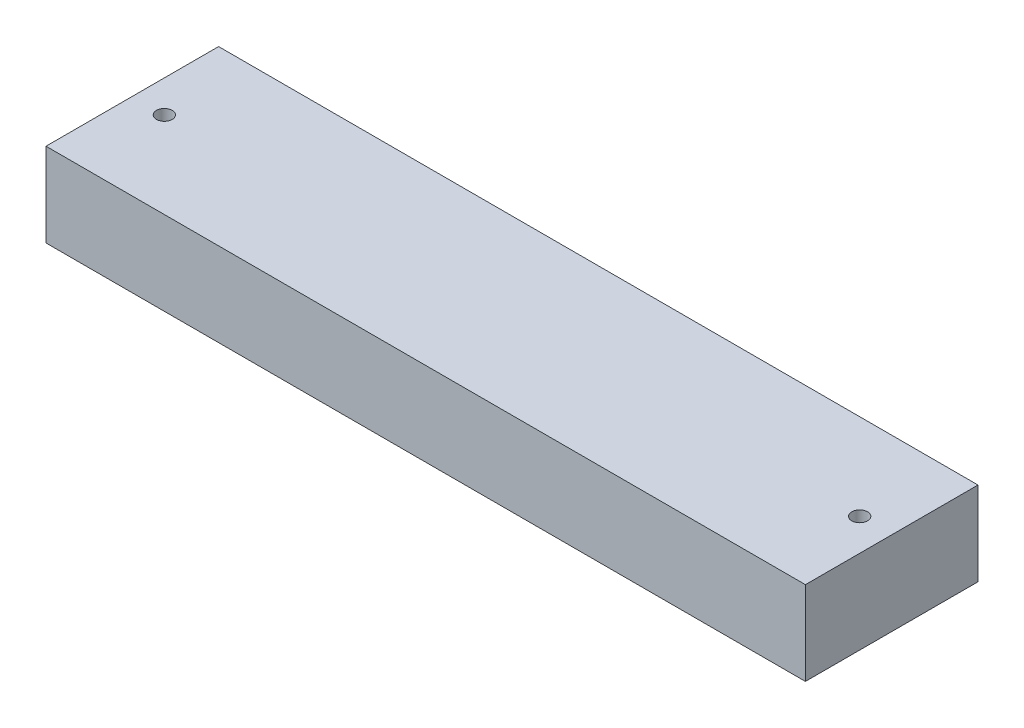
ISO-10303-21;
HEADER;
FILE_DESCRIPTION(('STEP AP214'),'2;1');
FILE_NAME('part.step','',(''),(''),'','','');
FILE_SCHEMA(('AUTOMOTIVE_DESIGN { 1 0 10303 214 1 1 1 1 }'));
ENDSEC;
DATA;
#1=APPLICATION_CONTEXT('core data for automotive mechanical design processes');
#2=APPLICATION_PROTOCOL_DEFINITION('international standard','automotive_design',2000,#1);
#3=PRODUCT_CONTEXT('',#1,'mechanical');
#4=PRODUCT('Part','Part','',(#3));
#5=PRODUCT_RELATED_PRODUCT_CATEGORY('part','',(#4));
#6=PRODUCT_DEFINITION_FORMATION('','',#4);
#7=PRODUCT_DEFINITION_CONTEXT('part definition',#1,'design');
#8=PRODUCT_DEFINITION('design','',#6,#7);
#9=PRODUCT_DEFINITION_SHAPE('','',#8);
#10=(LENGTH_UNIT() NAMED_UNIT(*) SI_UNIT(.MILLI.,.METRE.));
#11=(NAMED_UNIT(*) PLANE_ANGLE_UNIT() SI_UNIT($,.RADIAN.));
#12=(NAMED_UNIT(*) SI_UNIT($,.STERADIAN.) SOLID_ANGLE_UNIT());
#13=UNCERTAINTY_MEASURE_WITH_UNIT(LENGTH_MEASURE(1.E-05),#10,'distance_accuracy_value','');
#14=(GEOMETRIC_REPRESENTATION_CONTEXT(3) GLOBAL_UNCERTAINTY_ASSIGNED_CONTEXT((#13)) GLOBAL_UNIT_ASSIGNED_CONTEXT((#10,
#11,#12)) REPRESENTATION_CONTEXT('',''));
#15=CARTESIAN_POINT('',(0.,0.,0.));
#16=DIRECTION('',(0.,0.,1.));
#17=DIRECTION('',(1.,0.,0.));
#18=AXIS2_PLACEMENT_3D('',#15,#16,#17);
#19=CARTESIAN_POINT('',(77.,17.,17.5));
#20=DIRECTION('',(-1.,0.,0.));
#21=DIRECTION('',(0.,0.,1.));
#22=AXIS2_PLACEMENT_3D('',#19,#20,#21);
#23=PLANE('',#22);
#24=DIRECTION('',(0.,0.,-1.));
#25=VECTOR('',#24,1.);
#26=CARTESIAN_POINT('',(77.,0.,17.5));
#27=LINE('',#26,#25);
#28=CARTESIAN_POINT('',(77.,0.,17.5));
#29=VERTEX_POINT('',#28);
#30=CARTESIAN_POINT('',(77.,0.,-17.5));
#31=VERTEX_POINT('',#30);
#32=EDGE_CURVE('E106',#29,#31,#27,.T.);
#33=ORIENTED_EDGE('',*,*,#32,.T.);
#34=DIRECTION('',(0.,-1.,0.));
#35=VECTOR('',#34,1.);
#36=CARTESIAN_POINT('',(77.,17.,-17.5));
#37=LINE('',#36,#35);
#38=CARTESIAN_POINT('',(77.,17.,-17.5));
#39=VERTEX_POINT('',#38);
#40=EDGE_CURVE('E11',#39,#31,#37,.T.);
#41=ORIENTED_EDGE('',*,*,#40,.F.);
#42=DIRECTION('',(0.,0.,-1.));
#43=VECTOR('',#42,1.);
#44=CARTESIAN_POINT('',(77.,17.,17.5));
#45=LINE('',#44,#43);
#46=CARTESIAN_POINT('',(77.,17.,17.5));
#47=VERTEX_POINT('',#46);
#48=EDGE_CURVE('E94',#47,#39,#45,.T.);
#49=ORIENTED_EDGE('',*,*,#48,.F.);
#50=DIRECTION('',(0.,-1.,0.));
#51=VECTOR('',#50,1.);
#52=CARTESIAN_POINT('',(77.,17.,17.5));
#53=LINE('',#52,#51);
#54=EDGE_CURVE('E102',#47,#29,#53,.T.);
#55=ORIENTED_EDGE('',*,*,#54,.T.);
#56=EDGE_LOOP('',(#33,#41,#49,#55));
#57=FACE_BOUND('',#56,.T.);
#58=ADVANCED_FACE('F43',(#57),#23,.F.);
#59=CARTESIAN_POINT('',(-77.,17.,-17.5));
#60=DIRECTION('',(0.,0.,1.));
#61=DIRECTION('',(1.,0.,0.));
#62=AXIS2_PLACEMENT_3D('',#59,#60,#61);
#63=PLANE('',#62);
#64=DIRECTION('',(-1.,0.,0.));
#65=VECTOR('',#64,1.);
#66=CARTESIAN_POINT('',(-77.,0.,-17.5));
#67=LINE('',#66,#65);
#68=CARTESIAN_POINT('',(-77.,0.,-17.5));
#69=VERTEX_POINT('',#68);
#70=EDGE_CURVE('E98',#31,#69,#67,.T.);
#71=ORIENTED_EDGE('',*,*,#70,.T.);
#72=DIRECTION('',(0.,-1.,0.));
#73=VECTOR('',#72,1.);
#74=CARTESIAN_POINT('',(-77.,17.,-17.5));
#75=LINE('',#74,#73);
#76=CARTESIAN_POINT('',(-77.,17.,-17.5));
#77=VERTEX_POINT('',#76);
#78=EDGE_CURVE('E51',#77,#69,#75,.T.);
#79=ORIENTED_EDGE('',*,*,#78,.F.);
#80=DIRECTION('',(-1.,0.,0.));
#81=VECTOR('',#80,1.);
#82=CARTESIAN_POINT('',(-77.,17.,-17.5));
#83=LINE('',#82,#81);
#84=EDGE_CURVE('E89',#39,#77,#83,.T.);
#85=ORIENTED_EDGE('',*,*,#84,.F.);
#86=ORIENTED_EDGE('',*,*,#40,.T.);
#87=EDGE_LOOP('',(#71,#79,#85,#86));
#88=FACE_BOUND('',#87,.T.);
#89=ADVANCED_FACE('F97',(#88),#63,.F.);
#90=CARTESIAN_POINT('',(-77.,17.,17.5));
#91=DIRECTION('',(1.,0.,0.));
#92=DIRECTION('',(0.,0.,-1.));
#93=AXIS2_PLACEMENT_3D('',#90,#91,#92);
#94=PLANE('',#93);
#95=DIRECTION('',(0.,0.,1.));
#96=VECTOR('',#95,1.);
#97=CARTESIAN_POINT('',(-77.,0.,17.5));
#98=LINE('',#97,#96);
#99=CARTESIAN_POINT('',(-77.,0.,17.5));
#100=VERTEX_POINT('',#99);
#101=EDGE_CURVE('E76',#69,#100,#98,.T.);
#102=ORIENTED_EDGE('',*,*,#101,.T.);
#103=DIRECTION('',(0.,-1.,0.));
#104=VECTOR('',#103,1.);
#105=CARTESIAN_POINT('',(-77.,17.,17.5));
#106=LINE('',#105,#104);
#107=CARTESIAN_POINT('',(-77.,17.,17.5));
#108=VERTEX_POINT('',#107);
#109=EDGE_CURVE('E99',#108,#100,#106,.T.);
#110=ORIENTED_EDGE('',*,*,#109,.F.);
#111=DIRECTION('',(0.,0.,1.));
#112=VECTOR('',#111,1.);
#113=CARTESIAN_POINT('',(-77.,17.,17.5));
#114=LINE('',#113,#112);
#115=EDGE_CURVE('E92',#77,#108,#114,.T.);
#116=ORIENTED_EDGE('',*,*,#115,.F.);
#117=ORIENTED_EDGE('',*,*,#78,.T.);
#118=EDGE_LOOP('',(#102,#110,#116,#117));
#119=FACE_BOUND('',#118,.T.);
#120=ADVANCED_FACE('F100',(#119),#94,.F.);
#121=CARTESIAN_POINT('',(-77.,17.,17.5));
#122=DIRECTION('',(0.,0.,-1.));
#123=DIRECTION('',(-1.,0.,0.));
#124=AXIS2_PLACEMENT_3D('',#121,#122,#123);
#125=PLANE('',#124);
#126=DIRECTION('',(1.,0.,0.));
#127=VECTOR('',#126,1.);
#128=CARTESIAN_POINT('',(-77.,0.,17.5));
#129=LINE('',#128,#127);
#130=EDGE_CURVE('E82',#100,#29,#129,.T.);
#131=ORIENTED_EDGE('',*,*,#130,.T.);
#132=ORIENTED_EDGE('',*,*,#54,.F.);
#133=DIRECTION('',(1.,0.,0.));
#134=VECTOR('',#133,1.);
#135=CARTESIAN_POINT('',(-77.,17.,17.5));
#136=LINE('',#135,#134);
#137=EDGE_CURVE('E59',#108,#47,#136,.T.);
#138=ORIENTED_EDGE('',*,*,#137,.F.);
#139=ORIENTED_EDGE('',*,*,#109,.T.);
#140=EDGE_LOOP('',(#131,#132,#138,#139));
#141=FACE_BOUND('',#140,.T.);
#142=ADVANCED_FACE('F114',(#141),#125,.F.);
#143=CARTESIAN_POINT('',(0.,17.,0.));
#144=DIRECTION('',(0.,-1.,0.));
#145=DIRECTION('',(0.,0.,-1.));
#146=AXIS2_PLACEMENT_3D('',#143,#144,#145);
#147=PLANE('',#146);
#148=CARTESIAN_POINT('',(-70.5,17.,0.));
#149=DIRECTION('',(0.,1.,0.));
#150=DIRECTION('',(0.,0.,1.));
#151=AXIS2_PLACEMENT_3D('',#148,#149,#150);
#152=CIRCLE('',#151,1.59999999999999);
#153=CARTESIAN_POINT('',(-70.5,17.,1.59999999999999));
#154=VERTEX_POINT('',#153);
#155=EDGE_CURVE('E128',#154,#154,#152,.T.);
#156=ORIENTED_EDGE('',*,*,#155,.F.);
#157=EDGE_LOOP('',(#156));
#158=FACE_BOUND('',#157,.T.);
#159=CARTESIAN_POINT('',(70.5,17.,0.));
#160=DIRECTION('',(0.,1.,0.));
#161=DIRECTION('',(0.,0.,1.));
#162=AXIS2_PLACEMENT_3D('',#159,#160,#161);
#163=CIRCLE('',#162,1.59999999999999);
#164=CARTESIAN_POINT('',(70.5,17.,1.59999999999997));
#165=VERTEX_POINT('',#164);
#166=EDGE_CURVE('E122',#165,#165,#163,.T.);
#167=ORIENTED_EDGE('',*,*,#166,.F.);
#168=EDGE_LOOP('',(#167));
#169=FACE_BOUND('',#168,.T.);
#170=ORIENTED_EDGE('',*,*,#48,.T.);
#171=ORIENTED_EDGE('',*,*,#84,.T.);
#172=ORIENTED_EDGE('',*,*,#115,.T.);
#173=ORIENTED_EDGE('',*,*,#137,.T.);
#174=EDGE_LOOP('',(#170,#171,#172,#173));
#175=FACE_BOUND('',#174,.T.);
#176=ADVANCED_FACE('F90',(#158,#169,#175),#147,.F.);
#177=CARTESIAN_POINT('',(0.,0.,0.));
#178=DIRECTION('',(0.,-1.,0.));
#179=DIRECTION('',(0.,0.,-1.));
#180=AXIS2_PLACEMENT_3D('',#177,#178,#179);
#181=PLANE('',#180);
#182=CARTESIAN_POINT('',(-70.5,0.,0.));
#183=DIRECTION('',(0.,1.,0.));
#184=DIRECTION('',(0.,0.,1.));
#185=AXIS2_PLACEMENT_3D('',#182,#183,#184);
#186=CIRCLE('',#185,1.6);
#187=CARTESIAN_POINT('',(-70.5,0.,1.60000000000001));
#188=VERTEX_POINT('',#187);
#189=EDGE_CURVE('E125',#188,#188,#186,.T.);
#190=ORIENTED_EDGE('',*,*,#189,.T.);
#191=EDGE_LOOP('',(#190));
#192=FACE_BOUND('',#191,.T.);
#193=CARTESIAN_POINT('',(70.5,0.,0.));
#194=DIRECTION('',(0.,1.,0.));
#195=DIRECTION('',(0.,0.,1.));
#196=AXIS2_PLACEMENT_3D('',#193,#194,#195);
#197=CIRCLE('',#196,1.6);
#198=CARTESIAN_POINT('',(70.5,0.,1.59999999999998));
#199=VERTEX_POINT('',#198);
#200=EDGE_CURVE('E109',#199,#199,#197,.T.);
#201=ORIENTED_EDGE('',*,*,#200,.T.);
#202=EDGE_LOOP('',(#201));
#203=FACE_BOUND('',#202,.T.);
#204=ORIENTED_EDGE('',*,*,#32,.F.);
#205=ORIENTED_EDGE('',*,*,#130,.F.);
#206=ORIENTED_EDGE('',*,*,#101,.F.);
#207=ORIENTED_EDGE('',*,*,#70,.F.);
#208=EDGE_LOOP('',(#204,#205,#206,#207));
#209=FACE_BOUND('',#208,.T.);
#210=ADVANCED_FACE('F117',(#192,#203,#209),#181,.T.);
#211=CARTESIAN_POINT('',(70.5,17.,0.));
#212=DIRECTION('',(0.,1.,0.));
#213=DIRECTION('',(0.,0.,1.));
#214=AXIS2_PLACEMENT_3D('',#211,#212,#213);
#215=CYLINDRICAL_SURFACE('',#214,1.6);
#216=ORIENTED_EDGE('',*,*,#200,.F.);
#217=EDGE_LOOP('',(#216));
#218=FACE_BOUND('',#217,.T.);
#219=ORIENTED_EDGE('',*,*,#166,.T.);
#220=EDGE_LOOP('',(#219));
#221=FACE_BOUND('',#220,.T.);
#222=ADVANCED_FACE('F139',(#218,#221),#215,.F.);
#223=CARTESIAN_POINT('',(-70.5,17.,0.));
#224=DIRECTION('',(0.,1.,0.));
#225=DIRECTION('',(0.,0.,1.));
#226=AXIS2_PLACEMENT_3D('',#223,#224,#225);
#227=CYLINDRICAL_SURFACE('',#226,1.6);
#228=ORIENTED_EDGE('',*,*,#189,.F.);
#229=EDGE_LOOP('',(#228));
#230=FACE_BOUND('',#229,.T.);
#231=ORIENTED_EDGE('',*,*,#155,.T.);
#232=EDGE_LOOP('',(#231));
#233=FACE_BOUND('',#232,.T.);
#234=ADVANCED_FACE('F132',(#230,#233),#227,.F.);
#235=CLOSED_SHELL('',(#58,#89,#120,#142,#176,#210,#222,#234));
#236=MANIFOLD_SOLID_BREP('B2',#235);
#237=ADVANCED_BREP_SHAPE_REPRESENTATION('',(#18,#236),#14);
#238=SHAPE_DEFINITION_REPRESENTATION(#9,#237);
ENDSEC;
END-ISO-10303-21;
